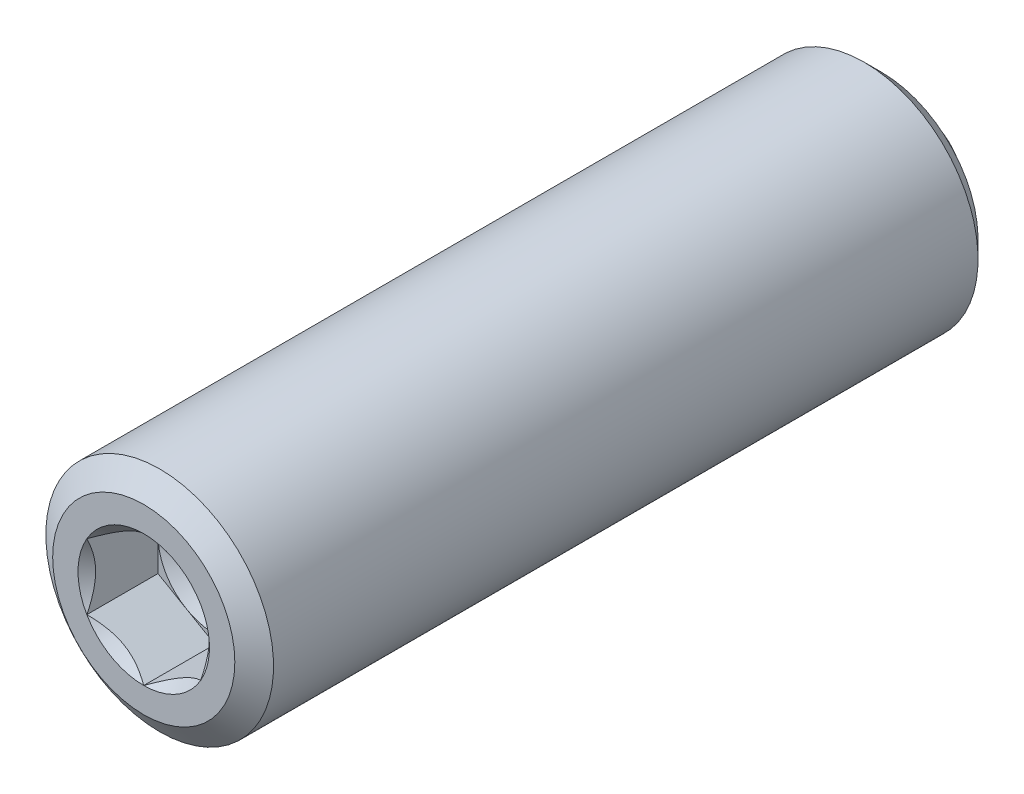
ISO-10303-21;
HEADER;
FILE_DESCRIPTION(('STEP AP214'),'2;1');
FILE_NAME('part.step','',(''),(''),'','','');
FILE_SCHEMA(('AUTOMOTIVE_DESIGN { 1 0 10303 214 1 1 1 1 }'));
ENDSEC;
DATA;
#1=APPLICATION_CONTEXT('core data for automotive mechanical design processes');
#2=APPLICATION_PROTOCOL_DEFINITION('international standard','automotive_design',2000,#1);
#3=PRODUCT_CONTEXT('',#1,'mechanical');
#4=PRODUCT('Part','Part','',(#3));
#5=PRODUCT_RELATED_PRODUCT_CATEGORY('part','',(#4));
#6=PRODUCT_DEFINITION_FORMATION('','',#4);
#7=PRODUCT_DEFINITION_CONTEXT('part definition',#1,'design');
#8=PRODUCT_DEFINITION('design','',#6,#7);
#9=PRODUCT_DEFINITION_SHAPE('','',#8);
#10=(LENGTH_UNIT() NAMED_UNIT(*) SI_UNIT(.MILLI.,.METRE.));
#11=(NAMED_UNIT(*) PLANE_ANGLE_UNIT() SI_UNIT($,.RADIAN.));
#12=(NAMED_UNIT(*) SI_UNIT($,.STERADIAN.) SOLID_ANGLE_UNIT());
#13=UNCERTAINTY_MEASURE_WITH_UNIT(LENGTH_MEASURE(1.E-05),#10,'distance_accuracy_value','');
#14=(GEOMETRIC_REPRESENTATION_CONTEXT(3) GLOBAL_UNCERTAINTY_ASSIGNED_CONTEXT((#13)) GLOBAL_UNIT_ASSIGNED_CONTEXT((#10,
#11,#12)) REPRESENTATION_CONTEXT('',''));
#15=CARTESIAN_POINT('',(0.,0.,0.));
#16=DIRECTION('',(0.,0.,1.));
#17=DIRECTION('',(1.,0.,0.));
#18=AXIS2_PLACEMENT_3D('',#15,#16,#17);
#19=CARTESIAN_POINT('',(0.,0.,-10.4));
#20=DIRECTION('',(0.,0.,-1.));
#21=DIRECTION('',(0.,1.,0.));
#22=AXIS2_PLACEMENT_3D('',#19,#20,#21);
#23=SPHERICAL_SURFACE('',#22,2.);
#24=CARTESIAN_POINT('',(0.,0.,-12.4));
#25=VERTEX_POINT('',#24);
#26=VERTEX_LOOP('',#25);
#27=FACE_BOUND('',#26,.T.);
#28=ADVANCED_FACE('F42',(#27),#23,.T.);
#29=CLOSED_SHELL('',(#28));
#30=MANIFOLD_SOLID_BREP('B2',#29);
#31=CARTESIAN_POINT('',(1.5,0.866025403784456,6.525));
#32=DIRECTION('',(0.,0.,-1.));
#33=DIRECTION('',(-1.,0.,0.));
#34=AXIS2_PLACEMENT_3D('',#31,#32,#33);
#35=PLANE('',#34);
#36=DIRECTION('',(0.,-1.,0.));
#37=VECTOR('',#36,1.);
#38=CARTESIAN_POINT('',(-1.5,0.866025403784456,6.525));
#39=LINE('',#38,#37);
#40=CARTESIAN_POINT('',(-1.5,0.866025403784456,6.525));
#41=VERTEX_POINT('',#40);
#42=CARTESIAN_POINT('',(-1.5,0.,6.525));
#43=VERTEX_POINT('',#42);
#44=EDGE_CURVE('E173',#41,#43,#39,.T.);
#45=ORIENTED_EDGE('',*,*,#44,.T.);
#46=CARTESIAN_POINT('',(0.,0.,6.525));
#47=DIRECTION('',(0.,0.,1.));
#48=DIRECTION('',(1.,0.,0.));
#49=AXIS2_PLACEMENT_3D('',#46,#47,#48);
#50=CIRCLE('',#49,1.5);
#51=CARTESIAN_POINT('',(-0.75,1.29903810567668,6.525));
#52=VERTEX_POINT('',#51);
#53=EDGE_CURVE('E70',#52,#43,#50,.T.);
#54=ORIENTED_EDGE('',*,*,#53,.F.);
#55=DIRECTION('',(-0.866025403784439,-0.5,0.));
#56=VECTOR('',#55,1.);
#57=CARTESIAN_POINT('',(0.,1.73205080756889,6.525));
#58=LINE('',#57,#56);
#59=EDGE_CURVE('E162',#52,#41,#58,.T.);
#60=ORIENTED_EDGE('',*,*,#59,.T.);
#61=EDGE_LOOP('',(#45,#54,#60));
#62=FACE_BOUND('',#61,.T.);
#63=ADVANCED_FACE('F55',(#62),#35,.F.);
#64=CARTESIAN_POINT('',(0.,1.73205080756889,6.525));
#65=VERTEX_POINT('',#64);
#66=EDGE_CURVE('E149',#65,#52,#58,.T.);
#67=ORIENTED_EDGE('',*,*,#66,.T.);
#68=CARTESIAN_POINT('',(0.75,1.29903810567668,6.525));
#69=VERTEX_POINT('',#68);
#70=EDGE_CURVE('E135',#69,#52,#50,.T.);
#71=ORIENTED_EDGE('',*,*,#70,.F.);
#72=DIRECTION('',(-0.866025403784439,0.5,0.));
#73=VECTOR('',#72,1.);
#74=CARTESIAN_POINT('',(1.5,0.866025403784455,6.525));
#75=LINE('',#74,#73);
#76=EDGE_CURVE('E146',#69,#65,#75,.T.);
#77=ORIENTED_EDGE('',*,*,#76,.T.);
#78=EDGE_LOOP('',(#67,#71,#77));
#79=FACE_BOUND('',#78,.T.);
#80=ADVANCED_FACE('F145',(#79),#35,.F.);
#81=CARTESIAN_POINT('',(1.5,0.866025403784455,6.525));
#82=VERTEX_POINT('',#81);
#83=EDGE_CURVE('E153',#82,#69,#75,.T.);
#84=ORIENTED_EDGE('',*,*,#83,.T.);
#85=CARTESIAN_POINT('',(1.5,0.,6.525));
#86=VERTEX_POINT('',#85);
#87=EDGE_CURVE('E133',#86,#69,#50,.T.);
#88=ORIENTED_EDGE('',*,*,#87,.F.);
#89=DIRECTION('',(0.,1.,0.));
#90=VECTOR('',#89,1.);
#91=CARTESIAN_POINT('',(1.5,-0.866025403784423,6.525));
#92=LINE('',#91,#90);
#93=EDGE_CURVE('E160',#86,#82,#92,.T.);
#94=ORIENTED_EDGE('',*,*,#93,.T.);
#95=EDGE_LOOP('',(#84,#88,#94));
#96=FACE_BOUND('',#95,.T.);
#97=ADVANCED_FACE('F159',(#96),#35,.F.);
#98=CARTESIAN_POINT('',(1.5,-0.866025403784423,6.525));
#99=VERTEX_POINT('',#98);
#100=EDGE_CURVE('E184',#99,#86,#92,.T.);
#101=ORIENTED_EDGE('',*,*,#100,.T.);
#102=CARTESIAN_POINT('',(0.75,-1.29903810567664,6.525));
#103=VERTEX_POINT('',#102);
#104=EDGE_CURVE('E137',#103,#86,#50,.T.);
#105=ORIENTED_EDGE('',*,*,#104,.F.);
#106=DIRECTION('',(0.866025403784439,0.5,0.));
#107=VECTOR('',#106,1.);
#108=CARTESIAN_POINT('',(0.,-1.73205080756886,6.525));
#109=LINE('',#108,#107);
#110=EDGE_CURVE('E180',#103,#99,#109,.T.);
#111=ORIENTED_EDGE('',*,*,#110,.T.);
#112=EDGE_LOOP('',(#101,#105,#111));
#113=FACE_BOUND('',#112,.T.);
#114=ADVANCED_FACE('F287',(#113),#35,.F.);
#115=CARTESIAN_POINT('',(0.,-1.73205080756886,6.525));
#116=VERTEX_POINT('',#115);
#117=EDGE_CURVE('E181',#116,#103,#109,.T.);
#118=ORIENTED_EDGE('',*,*,#117,.T.);
#119=CARTESIAN_POINT('',(-0.750000000000001,-1.29903810567664,6.525));
#120=VERTEX_POINT('',#119);
#121=EDGE_CURVE('E298',#120,#103,#50,.T.);
#122=ORIENTED_EDGE('',*,*,#121,.F.);
#123=DIRECTION('',(0.866025403784438,-0.5,0.));
#124=VECTOR('',#123,1.);
#125=CARTESIAN_POINT('',(-1.5,-0.866025403784422,6.525));
#126=LINE('',#125,#124);
#127=EDGE_CURVE('E176',#120,#116,#126,.T.);
#128=ORIENTED_EDGE('',*,*,#127,.T.);
#129=EDGE_LOOP('',(#118,#122,#128));
#130=FACE_BOUND('',#129,.T.);
#131=ADVANCED_FACE('F283',(#130),#35,.F.);
#132=CARTESIAN_POINT('',(0.,0.,-10.4));
#133=DIRECTION('',(0.,0.,-1.));
#134=DIRECTION('',(0.,-1.,0.));
#135=AXIS2_PLACEMENT_3D('',#132,#133,#134);
#136=SPHERICAL_SURFACE('',#135,2.05);
#137=CARTESIAN_POINT('',(0.,0.,-11.04));
#138=DIRECTION('',(0.,0.,-1.));
#139=DIRECTION('',(0.,1.,0.));
#140=AXIS2_PLACEMENT_3D('',#137,#138,#139);
#141=CIRCLE('',#140,1.94753690594042);
#142=CARTESIAN_POINT('',(0.,1.94753690594042,-11.04));
#143=VERTEX_POINT('',#142);
#144=EDGE_CURVE('E59',#143,#143,#141,.T.);
#145=ORIENTED_EDGE('',*,*,#144,.T.);
#146=EDGE_LOOP('',(#145));
#147=FACE_BOUND('',#146,.T.);
#148=ADVANCED_FACE('F57',(#147),#136,.F.);
#149=CARTESIAN_POINT('',(0.,2.54222570361947,-11.04));
#150=DIRECTION('',(0.,0.,-1.));
#151=DIRECTION('',(0.,1.,0.));
#152=AXIS2_PLACEMENT_3D('',#149,#150,#151);
#153=PLANE('',#152);
#154=CARTESIAN_POINT('',(0.,0.,-11.04));
#155=DIRECTION('',(0.,0.,-1.));
#156=DIRECTION('',(0.,1.,0.));
#157=AXIS2_PLACEMENT_3D('',#154,#155,#156);
#158=CIRCLE('',#157,2.54222570361947);
#159=CARTESIAN_POINT('',(0.,2.54222570361947,-11.04));
#160=VERTEX_POINT('',#159);
#161=EDGE_CURVE('E210',#160,#160,#158,.T.);
#162=ORIENTED_EDGE('',*,*,#161,.T.);
#163=EDGE_LOOP('',(#162));
#164=FACE_BOUND('',#163,.T.);
#165=ORIENTED_EDGE('',*,*,#144,.F.);
#166=EDGE_LOOP('',(#165));
#167=FACE_BOUND('',#166,.T.);
#168=ADVANCED_FACE('F293',(#164,#167),#153,.T.);
#169=CARTESIAN_POINT('',(0.,0.,-11.04));
#170=DIRECTION('',(0.,0.,1.));
#171=DIRECTION('',(0.,-1.,0.));
#172=AXIS2_PLACEMENT_3D('',#169,#170,#171);
#173=CONICAL_SURFACE('',#172,2.54222570361947,0.785398163397454);
#174=CARTESIAN_POINT('',(0.,0.,-10.5822257036195));
#175=DIRECTION('',(0.,0.,-1.));
#176=DIRECTION('',(0.,1.,0.));
#177=AXIS2_PLACEMENT_3D('',#174,#175,#176);
#178=CIRCLE('',#177,3.);
#179=CARTESIAN_POINT('',(0.,3.,-10.5822257036195));
#180=VERTEX_POINT('',#179);
#181=EDGE_CURVE('E207',#180,#180,#178,.T.);
#182=ORIENTED_EDGE('',*,*,#181,.T.);
#183=EDGE_LOOP('',(#182));
#184=FACE_BOUND('',#183,.T.);
#185=ORIENTED_EDGE('',*,*,#161,.F.);
#186=EDGE_LOOP('',(#185));
#187=FACE_BOUND('',#186,.T.);
#188=ADVANCED_FACE('F367',(#184,#187),#173,.T.);
#189=CARTESIAN_POINT('',(0.,0.,-12.4));
#190=DIRECTION('',(0.,0.,-1.));
#191=DIRECTION('',(0.,1.,0.));
#192=AXIS2_PLACEMENT_3D('',#189,#190,#191);
#193=CYLINDRICAL_SURFACE('',#192,3.);
#194=CARTESIAN_POINT('',(0.,0.,7.97987547707417));
#195=DIRECTION('',(0.,0.,-1.));
#196=DIRECTION('',(0.,1.,0.));
#197=AXIS2_PLACEMENT_3D('',#194,#195,#196);
#198=CIRCLE('',#197,3.);
#199=CARTESIAN_POINT('',(0.,3.,7.97987547707417));
#200=VERTEX_POINT('',#199);
#201=EDGE_CURVE('E204',#200,#200,#198,.T.);
#202=ORIENTED_EDGE('',*,*,#201,.T.);
#203=EDGE_LOOP('',(#202));
#204=FACE_BOUND('',#203,.T.);
#205=ORIENTED_EDGE('',*,*,#181,.F.);
#206=EDGE_LOOP('',(#205));
#207=FACE_BOUND('',#206,.T.);
#208=ADVANCED_FACE('F360',(#204,#207),#193,.T.);
#209=CARTESIAN_POINT('',(0.,0.,7.97987547707417));
#210=DIRECTION('',(0.,0.,-1.));
#211=DIRECTION('',(0.,1.,0.));
#212=AXIS2_PLACEMENT_3D('',#209,#210,#211);
#213=CONICAL_SURFACE('',#212,3.,0.959931088596882);
#214=CARTESIAN_POINT('',(0.,0.,8.4));
#215=DIRECTION('',(0.,0.,-1.));
#216=DIRECTION('',(0.,1.,0.));
#217=AXIS2_PLACEMENT_3D('',#214,#215,#216);
#218=CIRCLE('',#217,2.4);
#219=CARTESIAN_POINT('',(0.,2.4,8.4));
#220=VERTEX_POINT('',#219);
#221=EDGE_CURVE('E189',#220,#220,#218,.T.);
#222=ORIENTED_EDGE('',*,*,#221,.T.);
#223=EDGE_LOOP('',(#222));
#224=FACE_BOUND('',#223,.T.);
#225=ORIENTED_EDGE('',*,*,#201,.F.);
#226=EDGE_LOOP('',(#225));
#227=FACE_BOUND('',#226,.T.);
#228=ADVANCED_FACE('F355',(#224,#227),#213,.T.);
#229=CARTESIAN_POINT('',(0.,0.,8.4));
#230=DIRECTION('',(0.,0.,1.));
#231=DIRECTION('',(0.,-1.,0.));
#232=AXIS2_PLACEMENT_3D('',#229,#230,#231);
#233=PLANE('',#232);
#234=CARTESIAN_POINT('',(0.,0.,8.4));
#235=DIRECTION('',(0.,0.,1.));
#236=DIRECTION('',(1.,0.,0.));
#237=AXIS2_PLACEMENT_3D('',#234,#235,#236);
#238=CIRCLE('',#237,1.73205080756889);
#239=CARTESIAN_POINT('',(0.,-1.73205080756889,8.4));
#240=VERTEX_POINT('',#239);
#241=CARTESIAN_POINT('',(1.50000000000004,-0.866025403784403,8.4));
#242=VERTEX_POINT('',#241);
#243=EDGE_CURVE('E314',#240,#242,#238,.T.);
#244=ORIENTED_EDGE('',*,*,#243,.F.);
#245=CARTESIAN_POINT('',(-1.5,-0.866025403784422,8.4));
#246=VERTEX_POINT('',#245);
#247=EDGE_CURVE('E315',#246,#240,#238,.T.);
#248=ORIENTED_EDGE('',*,*,#247,.F.);
#249=CARTESIAN_POINT('',(-1.50000000000001,0.86602540378445,8.4));
#250=VERTEX_POINT('',#249);
#251=EDGE_CURVE('E313',#250,#246,#238,.T.);
#252=ORIENTED_EDGE('',*,*,#251,.F.);
#253=CARTESIAN_POINT('',(0.,1.73205080756889,8.4));
#254=VERTEX_POINT('',#253);
#255=EDGE_CURVE('E308',#254,#250,#238,.T.);
#256=ORIENTED_EDGE('',*,*,#255,.F.);
#257=CARTESIAN_POINT('',(1.5,0.866025403784466,8.4));
#258=VERTEX_POINT('',#257);
#259=EDGE_CURVE('E307',#258,#254,#238,.T.);
#260=ORIENTED_EDGE('',*,*,#259,.F.);
#261=EDGE_CURVE('E77',#242,#258,#238,.T.);
#262=ORIENTED_EDGE('',*,*,#261,.F.);
#263=EDGE_LOOP('',(#244,#248,#252,#256,#260,#262));
#264=FACE_BOUND('',#263,.T.);
#265=ORIENTED_EDGE('',*,*,#221,.F.);
#266=EDGE_LOOP('',(#265));
#267=FACE_BOUND('',#266,.T.);
#268=ADVANCED_FACE('F327',(#264,#267),#233,.T.);
#269=CARTESIAN_POINT('',(0.,0.,8.4));
#270=DIRECTION('',(0.,0.,1.));
#271=DIRECTION('',(1.,0.,0.));
#272=AXIS2_PLACEMENT_3D('',#269,#270,#271);
#273=CONICAL_SURFACE('',#272,1.73205080756889,0.78539816339745);
#274=ORIENTED_EDGE('',*,*,#255,.T.);
#275=CARTESIAN_POINT('',(0.000199999999999968,1.73216627762273,8.40011548160007));
#276=CARTESIAN_POINT('',(-0.0513677907370761,1.70239359975917,8.37036547606733));
#277=CARTESIAN_POINT('',(-0.103797917665202,1.67212305186357,8.34236248391031));
#278=CARTESIAN_POINT('',(-0.210709034055599,1.61039789003621,8.29108923044014));
#279=CARTESIAN_POINT('',(-0.265200195814664,1.57893740312616,8.26784750504437));
#280=CARTESIAN_POINT('',(-0.375079081357252,1.51549879897989,8.22803372899222));
#281=CARTESIAN_POINT('',(-0.430438809095204,1.48353684526812,8.2113615856709));
#282=CARTESIAN_POINT('',(-0.542377257477155,1.41890915196213,8.1856744568181));
#283=CARTESIAN_POINT('',(-0.598952556553014,1.3862453878112,8.17664029047886));
#284=CARTESIAN_POINT('',(-0.696455389516447,1.32995210095301,8.16848908122685));
#285=CARTESIAN_POINT('',(-0.737256908280473,1.30639533311125,8.16728225298921));
#286=CARTESIAN_POINT('',(-0.818787969615865,1.25932335290195,8.16931405716226));
#287=CARTESIAN_POINT('',(-0.859517494314637,1.23580815085315,8.17255367074831));
#288=CARTESIAN_POINT('',(-0.940584402163424,1.18900414978428,8.18329198598196));
#289=CARTESIAN_POINT('',(-0.980921384598297,1.16571558211721,8.19079465301873));
#290=CARTESIAN_POINT('',(-1.06091833691404,1.11952932016336,8.20965161192829));
#291=CARTESIAN_POINT('',(-1.10057800851622,1.09663179808787,8.22100755701858));
#292=CARTESIAN_POINT('',(-1.20216313477449,1.037981598097,8.25472164759267));
#293=CARTESIAN_POINT('',(-1.2634585537097,1.00259267147467,8.27962184909336));
#294=CARTESIAN_POINT('',(-1.35358562846332,0.950557780604389,8.32165665327157));
#295=CARTESIAN_POINT('',(-1.38328513990772,0.933410759677162,8.33642515355909));
#296=CARTESIAN_POINT('',(-1.44213790138375,0.899432101996423,8.36731056594016));
#297=CARTESIAN_POINT('',(-1.47129140422064,0.882600319285726,8.38342683412171));
#298=CARTESIAN_POINT('',(-1.5002,0.865909933730618,8.40011548160007));
#299=B_SPLINE_CURVE_WITH_KNOTS('',3,(#275,#276,#277,#278,#279,#280,#281,#282,#283,#284,#285,
#286,#287,#288,#289,#290,#291,#292,#293,#294,#295,#296,#297,#298),.UNSPECIFIED.,.F.,.F.,(4,2,2,
2,2,2,2,2,2,2,2,4),(0.,0.199829143693307,0.400822987382392,0.598623720538186,0.795926240188896,
0.937113067959889,1.07833105577194,1.21968061668223,1.36109089931056,1.58570969637566,
1.69770705470964,1.80965120737194),.UNSPECIFIED.);
#300=EDGE_CURVE('E40',#254,#250,#299,.T.);
#301=ORIENTED_EDGE('',*,*,#300,.F.);
#302=EDGE_LOOP('',(#274,#301));
#303=FACE_BOUND('',#302,.T.);
#304=ADVANCED_FACE('F226',(#303),#273,.F.);
#305=ORIENTED_EDGE('',*,*,#251,.T.);
#306=CARTESIAN_POINT('',(-1.5,-1.7272081296969,8.95557851627076));
#307=CARTESIAN_POINT('',(-1.5,-1.68515175699266,8.9238299078574));
#308=CARTESIAN_POINT('',(-1.5,-1.64286104748672,8.89239259380735));
#309=CARTESIAN_POINT('',(-1.5,-1.5577158103594,8.83026908755638));
#310=CARTESIAN_POINT('',(-1.5,-1.51486114386666,8.79958308589218));
#311=CARTESIAN_POINT('',(-1.5,-1.38468134151269,8.70840719242713));
#312=CARTESIAN_POINT('',(-1.5,-1.29637976071652,8.64928834342675));
#313=CARTESIAN_POINT('',(-1.5,-1.11121478730466,8.53323099631648));
#314=CARTESIAN_POINT('',(-1.5,-1.01415038238166,8.47660955873299));
#315=CARTESIAN_POINT('',(-1.5,-0.815173408897593,8.37303688126563));
#316=CARTESIAN_POINT('',(-1.5,-0.713278669253274,8.32605304154165));
#317=CARTESIAN_POINT('',(-1.5,-0.560333774943103,8.26857266843081));
#318=CARTESIAN_POINT('',(-1.5,-0.511547982948033,8.25207538775723));
#319=CARTESIAN_POINT('',(-1.5,-0.412798620136858,8.22299751292699));
#320=CARTESIAN_POINT('',(-1.5,-0.362834968437555,8.210417188594));
#321=CARTESIAN_POINT('',(-1.5,-0.262863235444974,8.19003619414675));
#322=CARTESIAN_POINT('',(-1.5,-0.212872113808015,8.18215363274596));
#323=CARTESIAN_POINT('',(-1.5,-0.112355243569539,8.17132206396899));
#324=CARTESIAN_POINT('',(-1.5,-0.0618295883726218,8.16837220852434));
#325=CARTESIAN_POINT('',(-1.5,0.0374291733323895,8.16762485772483));
#326=CARTESIAN_POINT('',(-1.5,0.0861609672003042,8.16964473355806));
#327=CARTESIAN_POINT('',(-1.5,0.183206937768831,8.17832255289674));
#328=CARTESIAN_POINT('',(-1.5,0.231521073438273,8.18498094696844));
#329=CARTESIAN_POINT('',(-1.5,0.32819985342544,8.20268524412255));
#330=CARTESIAN_POINT('',(-1.5,0.376550616310332,8.21380581125702));
#331=CARTESIAN_POINT('',(-1.5,0.472195697125602,8.2398434140487));
#332=CARTESIAN_POINT('',(-1.5,0.519490103092743,8.25476013204092));
#333=CARTESIAN_POINT('',(-1.5,0.668391282696627,8.30733522359606));
#334=CARTESIAN_POINT('',(-1.5,0.767878709508555,8.35098128747196));
#335=CARTESIAN_POINT('',(-1.5,0.962179866690727,8.44802299459308));
#336=CARTESIAN_POINT('',(-1.5,1.05697519961444,8.50145366508952));
#337=CARTESIAN_POINT('',(-1.5,1.23814273533383,8.61168585200454));
#338=CARTESIAN_POINT('',(-1.5,1.3246994218129,8.66818792069858));
#339=CARTESIAN_POINT('',(-1.5,1.45222331290674,8.75553430157865));
#340=CARTESIAN_POINT('',(-1.5,1.49418091978756,8.78495775868003));
#341=CARTESIAN_POINT('',(-1.5,1.57752272931477,8.84458282183045));
#342=CARTESIAN_POINT('',(-1.5,1.61890708647355,8.87478421166442));
#343=CARTESIAN_POINT('',(-1.5,1.66005278019494,8.90530817860944));
#344=B_SPLINE_CURVE_WITH_KNOTS('',3,(#306,#307,#308,#309,#310,#311,#312,#313,#314,#315,#316,
#317,#318,#319,#320,#321,#322,#323,#324,#325,#326,#327,#328,#329,#330,#331,#332,#333,#334,#335,
#336,#337,#338,#339,#340,#341,#342,#343),.UNSPECIFIED.,.F.,.F.,(4,2,2,2,2,2,2,2,2,2,2,2,2,2,2,2,
2,2,4),(0.,0.158079548982665,0.316198780993938,0.634850417346953,0.9716903113615,
1.30737131660665,1.46173961127087,1.61611853740676,1.76772101421408,1.91929742368536,
2.06538741209598,2.21149159305542,2.3601498463387,2.50879566386707,2.83376031422671,
3.1599118698565,3.46985601802196,3.62358896039972,3.77727962642069),.UNSPECIFIED.);
#345=EDGE_CURVE('E233',#250,#246,#344,.F.);
#346=ORIENTED_EDGE('',*,*,#345,.F.);
#347=EDGE_LOOP('',(#305,#346));
#348=FACE_BOUND('',#347,.T.);
#349=ADVANCED_FACE('F324',(#348),#273,.F.);
#350=ORIENTED_EDGE('',*,*,#247,.T.);
#351=CARTESIAN_POINT('',(-1.5002,-0.865909933730585,8.40011548160005));
#352=CARTESIAN_POINT('',(-1.44863220926292,-0.89568261159415,8.3703654760673));
#353=CARTESIAN_POINT('',(-1.3962020823348,-0.925953159489749,8.34236248391029));
#354=CARTESIAN_POINT('',(-1.2892909659444,-0.987678321317108,8.29108923044012));
#355=CARTESIAN_POINT('',(-1.23479980418534,-1.01913880822716,8.26784750504435));
#356=CARTESIAN_POINT('',(-1.12492091864275,-1.08257741237343,8.22803372899219));
#357=CARTESIAN_POINT('',(-1.0695611909048,-1.1145393660852,8.21136158567087));
#358=CARTESIAN_POINT('',(-0.957622742522845,-1.17916705939119,8.18567445681808));
#359=CARTESIAN_POINT('',(-0.901047443446987,-1.21183082354212,8.17664029047884));
#360=CARTESIAN_POINT('',(-0.803544610483554,-1.26812411040031,8.16848908122682));
#361=CARTESIAN_POINT('',(-0.762743091719529,-1.29168087824206,8.16728225298919));
#362=CARTESIAN_POINT('',(-0.681212030384138,-1.33875285845137,8.16931405716224));
#363=CARTESIAN_POINT('',(-0.640482505685367,-1.36226806050017,8.17255367074828));
#364=CARTESIAN_POINT('',(-0.559415597836581,-1.40907206156904,8.18329198598193));
#365=CARTESIAN_POINT('',(-0.519078615401709,-1.43236062923611,8.1907946530187));
#366=CARTESIAN_POINT('',(-0.439081663085967,-1.47854689118995,8.20965161192826));
#367=CARTESIAN_POINT('',(-0.399421991483791,-1.50144441326544,8.22100755701856));
#368=CARTESIAN_POINT('',(-0.297836865225514,-1.56009461325632,8.25472164759264));
#369=CARTESIAN_POINT('',(-0.23654144629031,-1.59548353987865,8.27962184909334));
#370=CARTESIAN_POINT('',(-0.146414371536686,-1.64751843074893,8.32165665327155));
#371=CARTESIAN_POINT('',(-0.116714860092282,-1.66466545167615,8.33642515355907));
#372=CARTESIAN_POINT('',(-0.0578620986162489,-1.69864410935689,8.36731056594014));
#373=CARTESIAN_POINT('',(-0.0287085957793631,-1.71547589206759,8.38342683412168));
#374=CARTESIAN_POINT('',(0.000199999999999281,-1.7321662776227,8.40011548160004));
#375=B_SPLINE_CURVE_WITH_KNOTS('',3,(#351,#352,#353,#354,#355,#356,#357,#358,#359,#360,#361,
#362,#363,#364,#365,#366,#367,#368,#369,#370,#371,#372,#373,#374),.UNSPECIFIED.,.F.,.F.,(4,2,2,
2,2,2,2,2,2,2,2,4),(0.,0.199829143693306,0.400822987382392,0.598623720538186,0.795926240188896,
0.937113067959887,1.07833105577193,1.21968061668222,1.36109089931055,1.58570969637566,
1.69770705470964,1.80965120737194),.UNSPECIFIED.);
#376=EDGE_CURVE('E240',#246,#240,#375,.T.);
#377=ORIENTED_EDGE('',*,*,#376,.F.);
#378=EDGE_LOOP('',(#350,#377));
#379=FACE_BOUND('',#378,.T.);
#380=ADVANCED_FACE('F342',(#379),#273,.F.);
#381=ORIENTED_EDGE('',*,*,#243,.T.);
#382=CARTESIAN_POINT('',(-0.000200000000000205,-1.7321662776227,8.40011548160004));
#383=CARTESIAN_POINT('',(0.0513677907370746,-1.70239359975913,8.3703654760673));
#384=CARTESIAN_POINT('',(0.103797917665199,-1.67212305186354,8.34236248391028));
#385=CARTESIAN_POINT('',(0.210709034055594,-1.61039789003618,8.29108923044011));
#386=CARTESIAN_POINT('',(0.265200195814658,-1.57893740312613,8.26784750504435));
#387=CARTESIAN_POINT('',(0.375079081357245,-1.51549879897986,8.22803372899219));
#388=CARTESIAN_POINT('',(0.430438809095196,-1.48353684526809,8.21136158567087));
#389=CARTESIAN_POINT('',(0.542377257477145,-1.4189091519621,8.18567445681808));
#390=CARTESIAN_POINT('',(0.598952556553003,-1.38624538781117,8.17664029047884));
#391=CARTESIAN_POINT('',(0.696455389516435,-1.32995210095298,8.16848908122682));
#392=CARTESIAN_POINT('',(0.73725690828046,-1.30639533311123,8.16728225298919));
#393=CARTESIAN_POINT('',(0.818787969615851,-1.25932335290192,8.16931405716224));
#394=CARTESIAN_POINT('',(0.859517494314622,-1.23580815085312,8.17255367074828));
#395=CARTESIAN_POINT('',(0.940584402163408,-1.18900414978425,8.18329198598193));
#396=CARTESIAN_POINT('',(0.980921384598279,-1.16571558211718,8.1907946530187));
#397=CARTESIAN_POINT('',(1.06091833691402,-1.11952932016334,8.20965161192826));
#398=CARTESIAN_POINT('',(1.1005780085162,-1.09663179808785,8.22100755701856));
#399=CARTESIAN_POINT('',(1.20216313477448,-1.03798159809697,8.25472164759264));
#400=CARTESIAN_POINT('',(1.26345855370968,-1.00259267147464,8.27962184909334));
#401=CARTESIAN_POINT('',(1.35358562846331,-0.950557780604361,8.32165665327155));
#402=CARTESIAN_POINT('',(1.38328513990772,-0.933410759677133,8.33642515355907));
#403=CARTESIAN_POINT('',(1.44213790138375,-0.899432101996392,8.36731056594014));
#404=CARTESIAN_POINT('',(1.47129140422064,-0.882600319285695,8.38342683412169));
#405=CARTESIAN_POINT('',(1.5002,-0.865909933730585,8.40011548160005));
#406=B_SPLINE_CURVE_WITH_KNOTS('',3,(#382,#383,#384,#385,#386,#387,#388,#389,#390,#391,#392,
#393,#394,#395,#396,#397,#398,#399,#400,#401,#402,#403,#404,#405),.UNSPECIFIED.,.F.,.F.,(4,2,2,
2,2,2,2,2,2,2,2,4),(0.,0.199829143693303,0.400822987382385,0.598623720538175,0.795926240188882,
0.937113067959873,1.07833105577192,1.21968061668221,1.36109089931053,1.58570969637565,
1.69770705470963,1.80965120737194),.UNSPECIFIED.);
#407=EDGE_CURVE('E246',#240,#242,#406,.T.);
#408=ORIENTED_EDGE('',*,*,#407,.F.);
#409=EDGE_LOOP('',(#381,#408));
#410=FACE_BOUND('',#409,.T.);
#411=ADVANCED_FACE('F338',(#410),#273,.F.);
#412=ORIENTED_EDGE('',*,*,#261,.T.);
#413=CARTESIAN_POINT('',(1.5,-1.7272081296969,8.95557851627076));
#414=CARTESIAN_POINT('',(1.5,-1.68515175699266,8.9238299078574));
#415=CARTESIAN_POINT('',(1.5,-1.64286104748672,8.89239259380735));
#416=CARTESIAN_POINT('',(1.5,-1.5577158103594,8.83026908755638));
#417=CARTESIAN_POINT('',(1.5,-1.51486114386666,8.79958308589217));
#418=CARTESIAN_POINT('',(1.5,-1.38468134151269,8.70840719242713));
#419=CARTESIAN_POINT('',(1.5,-1.29637976071652,8.64928834342675));
#420=CARTESIAN_POINT('',(1.5,-1.11121478730466,8.53323099631648));
#421=CARTESIAN_POINT('',(1.5,-1.01415038238166,8.47660955873299));
#422=CARTESIAN_POINT('',(1.5,-0.815173408897594,8.37303688126563));
#423=CARTESIAN_POINT('',(1.5,-0.713278669253275,8.32605304154165));
#424=CARTESIAN_POINT('',(1.5,-0.560333774943103,8.26857266843081));
#425=CARTESIAN_POINT('',(1.5,-0.511547982948033,8.25207538775723));
#426=CARTESIAN_POINT('',(1.5,-0.412798620136858,8.22299751292699));
#427=CARTESIAN_POINT('',(1.5,-0.362834968437555,8.210417188594));
#428=CARTESIAN_POINT('',(1.5,-0.262863235444975,8.19003619414675));
#429=CARTESIAN_POINT('',(1.5,-0.212872113808016,8.18215363274596));
#430=CARTESIAN_POINT('',(1.5,-0.112355243569539,8.17132206396899));
#431=CARTESIAN_POINT('',(1.5,-0.0618295883726222,8.16837220852434));
#432=CARTESIAN_POINT('',(1.5,0.0374291733323891,8.16762485772483));
#433=CARTESIAN_POINT('',(1.5,0.0861609672003037,8.16964473355806));
#434=CARTESIAN_POINT('',(1.5,0.183206937768831,8.17832255289674));
#435=CARTESIAN_POINT('',(1.5,0.231521073438273,8.18498094696844));
#436=CARTESIAN_POINT('',(1.5,0.328199853425439,8.20268524412255));
#437=CARTESIAN_POINT('',(1.5,0.376550616310331,8.21380581125702));
#438=CARTESIAN_POINT('',(1.5,0.472195697125601,8.2398434140487));
#439=CARTESIAN_POINT('',(1.5,0.519490103092743,8.25476013204092));
#440=CARTESIAN_POINT('',(1.5,0.668391282696627,8.30733522359606));
#441=CARTESIAN_POINT('',(1.5,0.767878709508555,8.35098128747196));
#442=CARTESIAN_POINT('',(1.5,0.962179866690726,8.44802299459308));
#443=CARTESIAN_POINT('',(1.5,1.05697519961444,8.50145366508952));
#444=CARTESIAN_POINT('',(1.5,1.23814273533383,8.61168585200454));
#445=CARTESIAN_POINT('',(1.5,1.3246994218129,8.66818792069858));
#446=CARTESIAN_POINT('',(1.5,1.45222331290674,8.75553430157865));
#447=CARTESIAN_POINT('',(1.5,1.49418091978756,8.78495775868003));
#448=CARTESIAN_POINT('',(1.5,1.57752272931477,8.84458282183045));
#449=CARTESIAN_POINT('',(1.5,1.61890708647355,8.87478421166443));
#450=CARTESIAN_POINT('',(1.5,1.66005278019494,8.90530817860944));
#451=B_SPLINE_CURVE_WITH_KNOTS('',3,(#413,#414,#415,#416,#417,#418,#419,#420,#421,#422,#423,
#424,#425,#426,#427,#428,#429,#430,#431,#432,#433,#434,#435,#436,#437,#438,#439,#440,#441,#442,
#443,#444,#445,#446,#447,#448,#449,#450),.UNSPECIFIED.,.F.,.F.,(4,2,2,2,2,2,2,2,2,2,2,2,2,2,2,2,
2,2,4),(0.,0.158079548982668,0.31619878099394,0.634850417346953,0.9716903113615,
1.30737131660665,1.46173961127087,1.61611853740676,1.76772101421408,1.91929742368536,
2.06538741209598,2.21149159305542,2.3601498463387,2.50879566386707,2.83376031422671,
3.1599118698565,3.46985601802195,3.62358896039972,3.77727962642069),.UNSPECIFIED.);
#452=EDGE_CURVE('E251',#242,#258,#451,.T.);
#453=ORIENTED_EDGE('',*,*,#452,.F.);
#454=EDGE_LOOP('',(#412,#453));
#455=FACE_BOUND('',#454,.T.);
#456=ADVANCED_FACE('F224',(#455),#273,.F.);
#457=ORIENTED_EDGE('',*,*,#259,.T.);
#458=CARTESIAN_POINT('',(1.5002,0.865909933730618,8.40011548160006));
#459=CARTESIAN_POINT('',(1.44863220926292,0.895682611594182,8.37036547606732));
#460=CARTESIAN_POINT('',(1.3962020823348,0.925953159489782,8.34236248391031));
#461=CARTESIAN_POINT('',(1.2892909659444,0.98767832131714,8.29108923044014));
#462=CARTESIAN_POINT('',(1.23479980418534,1.01913880822719,8.26784750504437));
#463=CARTESIAN_POINT('',(1.12492091864275,1.08257741237346,8.22803372899222));
#464=CARTESIAN_POINT('',(1.0695611909048,1.11453936608523,8.21136158567089));
#465=CARTESIAN_POINT('',(0.957622742522854,1.17916705939122,8.1856744568181));
#466=CARTESIAN_POINT('',(0.901047443446996,1.21183082354215,8.17664029047886));
#467=CARTESIAN_POINT('',(0.803544610483564,1.26812411040034,8.16848908122685));
#468=CARTESIAN_POINT('',(0.762743091719538,1.29168087824209,8.16728225298921));
#469=CARTESIAN_POINT('',(0.681212030384146,1.3387528584514,8.16931405716226));
#470=CARTESIAN_POINT('',(0.640482505685374,1.3622680605002,8.17255367074831));
#471=CARTESIAN_POINT('',(0.559415597836587,1.40907206156907,8.18329198598196));
#472=CARTESIAN_POINT('',(0.519078615401715,1.43236062923614,8.19079465301873));
#473=CARTESIAN_POINT('',(0.439081663085971,1.47854689118998,8.20965161192829));
#474=CARTESIAN_POINT('',(0.399421991483794,1.50144441326547,8.22100755701858));
#475=CARTESIAN_POINT('',(0.297836865225516,1.56009461325635,8.25472164759267));
#476=CARTESIAN_POINT('',(0.236541446290312,1.59548353987868,8.27962184909337));
#477=CARTESIAN_POINT('',(0.146414371536688,1.64751843074896,8.32165665327158));
#478=CARTESIAN_POINT('',(0.116714860092284,1.66466545167618,8.3364251535591));
#479=CARTESIAN_POINT('',(0.0578620986162505,1.69864410935693,8.36731056594017));
#480=CARTESIAN_POINT('',(0.0287085957793638,1.71547589206762,8.38342683412171));
#481=CARTESIAN_POINT('',(-0.000199999999999509,1.73216627762273,8.40011548160007));
#482=B_SPLINE_CURVE_WITH_KNOTS('',3,(#458,#459,#460,#461,#462,#463,#464,#465,#466,#467,#468,
#469,#470,#471,#472,#473,#474,#475,#476,#477,#478,#479,#480,#481),.UNSPECIFIED.,.F.,.F.,(4,2,2,
2,2,2,2,2,2,2,2,4),(0.,0.199829143693303,0.400822987382385,0.598623720538175,0.795926240188881,
0.937113067959874,1.07833105577192,1.21968061668221,1.36109089931054,1.58570969637565,
1.69770705470963,1.80965120737193),.UNSPECIFIED.);
#483=EDGE_CURVE('E157',#258,#254,#482,.T.);
#484=ORIENTED_EDGE('',*,*,#483,.F.);
#485=EDGE_LOOP('',(#457,#484));
#486=FACE_BOUND('',#485,.T.);
#487=ADVANCED_FACE('F219',(#486),#273,.F.);
#488=CARTESIAN_POINT('',(-1.5,-0.866025403784422,6.525));
#489=VERTEX_POINT('',#488);
#490=EDGE_CURVE('E177',#489,#120,#126,.T.);
#491=ORIENTED_EDGE('',*,*,#490,.T.);
#492=EDGE_CURVE('E306',#43,#120,#50,.T.);
#493=ORIENTED_EDGE('',*,*,#492,.F.);
#494=EDGE_CURVE('E172',#43,#489,#39,.T.);
#495=ORIENTED_EDGE('',*,*,#494,.T.);
#496=EDGE_LOOP('',(#491,#493,#495));
#497=FACE_BOUND('',#496,.T.);
#498=ADVANCED_FACE('F223',(#497),#35,.F.);
#499=CARTESIAN_POINT('',(0.,1.73205080756889,6.525));
#500=DIRECTION('',(-0.5,0.866025403784439,0.));
#501=DIRECTION('',(-0.866025403784439,-0.5,0.));
#502=AXIS2_PLACEMENT_3D('',#499,#500,#501);
#503=PLANE('',#502);
#504=DIRECTION('',(0.,0.,1.));
#505=VECTOR('',#504,1.);
#506=CARTESIAN_POINT('',(0.,1.73205080756889,6.525));
#507=LINE('',#506,#505);
#508=EDGE_CURVE('E156',#65,#254,#507,.T.);
#509=ORIENTED_EDGE('',*,*,#508,.T.);
#510=ORIENTED_EDGE('',*,*,#300,.T.);
#511=DIRECTION('',(0.,0.,1.));
#512=VECTOR('',#511,1.);
#513=CARTESIAN_POINT('',(-1.5,0.866025403784456,6.525));
#514=LINE('',#513,#512);
#515=EDGE_CURVE('E198',#41,#250,#514,.T.);
#516=ORIENTED_EDGE('',*,*,#515,.F.);
#517=ORIENTED_EDGE('',*,*,#59,.F.);
#518=ORIENTED_EDGE('',*,*,#66,.F.);
#519=EDGE_LOOP('',(#509,#510,#516,#517,#518));
#520=FACE_BOUND('',#519,.T.);
#521=ADVANCED_FACE('F216',(#520),#503,.F.);
#522=CARTESIAN_POINT('',(-1.5,0.866025403784456,6.525));
#523=DIRECTION('',(-1.,0.,0.));
#524=DIRECTION('',(0.,0.,1.));
#525=AXIS2_PLACEMENT_3D('',#522,#523,#524);
#526=PLANE('',#525);
#527=ORIENTED_EDGE('',*,*,#515,.T.);
#528=ORIENTED_EDGE('',*,*,#345,.T.);
#529=DIRECTION('',(0.,0.,1.));
#530=VECTOR('',#529,1.);
#531=CARTESIAN_POINT('',(-1.5,-0.866025403784422,6.525));
#532=LINE('',#531,#530);
#533=EDGE_CURVE('E196',#489,#246,#532,.T.);
#534=ORIENTED_EDGE('',*,*,#533,.F.);
#535=ORIENTED_EDGE('',*,*,#494,.F.);
#536=ORIENTED_EDGE('',*,*,#44,.F.);
#537=EDGE_LOOP('',(#527,#528,#534,#535,#536));
#538=FACE_BOUND('',#537,.T.);
#539=ADVANCED_FACE('F267',(#538),#526,.F.);
#540=CARTESIAN_POINT('',(-1.5,-0.866025403784422,6.525));
#541=DIRECTION('',(-0.5,-0.866025403784438,0.));
#542=DIRECTION('',(0.866025403784439,-0.5,0.));
#543=AXIS2_PLACEMENT_3D('',#540,#541,#542);
#544=PLANE('',#543);
#545=ORIENTED_EDGE('',*,*,#533,.T.);
#546=ORIENTED_EDGE('',*,*,#376,.T.);
#547=DIRECTION('',(0.,0.,1.));
#548=VECTOR('',#547,1.);
#549=CARTESIAN_POINT('',(0.,-1.73205080756886,6.525));
#550=LINE('',#549,#548);
#551=EDGE_CURVE('E193',#116,#240,#550,.T.);
#552=ORIENTED_EDGE('',*,*,#551,.F.);
#553=ORIENTED_EDGE('',*,*,#127,.F.);
#554=ORIENTED_EDGE('',*,*,#490,.F.);
#555=EDGE_LOOP('',(#545,#546,#552,#553,#554));
#556=FACE_BOUND('',#555,.T.);
#557=ADVANCED_FACE('F263',(#556),#544,.F.);
#558=CARTESIAN_POINT('',(0.,-1.73205080756886,6.525));
#559=DIRECTION('',(0.5,-0.866025403784439,0.));
#560=DIRECTION('',(0.866025403784439,0.5,0.));
#561=AXIS2_PLACEMENT_3D('',#558,#559,#560);
#562=PLANE('',#561);
#563=ORIENTED_EDGE('',*,*,#551,.T.);
#564=ORIENTED_EDGE('',*,*,#407,.T.);
#565=DIRECTION('',(0.,0.,1.));
#566=VECTOR('',#565,1.);
#567=CARTESIAN_POINT('',(1.5,-0.866025403784423,6.525));
#568=LINE('',#567,#566);
#569=EDGE_CURVE('E190',#99,#242,#568,.T.);
#570=ORIENTED_EDGE('',*,*,#569,.F.);
#571=ORIENTED_EDGE('',*,*,#110,.F.);
#572=ORIENTED_EDGE('',*,*,#117,.F.);
#573=EDGE_LOOP('',(#563,#564,#570,#571,#572));
#574=FACE_BOUND('',#573,.T.);
#575=ADVANCED_FACE('F259',(#574),#562,.F.);
#576=CARTESIAN_POINT('',(1.5,-0.866025403784423,6.525));
#577=DIRECTION('',(1.,0.,0.));
#578=DIRECTION('',(0.,1.,0.));
#579=AXIS2_PLACEMENT_3D('',#576,#577,#578);
#580=PLANE('',#579);
#581=ORIENTED_EDGE('',*,*,#569,.T.);
#582=ORIENTED_EDGE('',*,*,#452,.T.);
#583=DIRECTION('',(0.,0.,1.));
#584=VECTOR('',#583,1.);
#585=CARTESIAN_POINT('',(1.5,0.866025403784455,6.525));
#586=LINE('',#585,#584);
#587=EDGE_CURVE('E187',#82,#258,#586,.T.);
#588=ORIENTED_EDGE('',*,*,#587,.F.);
#589=ORIENTED_EDGE('',*,*,#93,.F.);
#590=ORIENTED_EDGE('',*,*,#100,.F.);
#591=EDGE_LOOP('',(#581,#582,#588,#589,#590));
#592=FACE_BOUND('',#591,.T.);
#593=ADVANCED_FACE('F256',(#592),#580,.F.);
#594=CARTESIAN_POINT('',(1.5,0.866025403784455,6.525));
#595=DIRECTION('',(0.5,0.866025403784439,0.));
#596=DIRECTION('',(-0.866025403784439,0.5,0.));
#597=AXIS2_PLACEMENT_3D('',#594,#595,#596);
#598=PLANE('',#597);
#599=ORIENTED_EDGE('',*,*,#587,.T.);
#600=ORIENTED_EDGE('',*,*,#483,.T.);
#601=ORIENTED_EDGE('',*,*,#508,.F.);
#602=ORIENTED_EDGE('',*,*,#76,.F.);
#603=ORIENTED_EDGE('',*,*,#83,.F.);
#604=EDGE_LOOP('',(#599,#600,#601,#602,#603));
#605=FACE_BOUND('',#604,.T.);
#606=ADVANCED_FACE('F130',(#605),#598,.F.);
#607=CARTESIAN_POINT('',(0.,0.,6.525));
#608=DIRECTION('',(0.,0.,1.));
#609=DIRECTION('',(1.,0.,0.));
#610=AXIS2_PLACEMENT_3D('',#607,#608,#609);
#611=CONICAL_SURFACE('',#610,1.5,1.0471975511966);
#612=CARTESIAN_POINT('',(0.,0.,5.65897459621556));
#613=VERTEX_POINT('',#612);
#614=VERTEX_LOOP('',#613);
#615=FACE_BOUND('',#614,.T.);
#616=ORIENTED_EDGE('',*,*,#87,.T.);
#617=ORIENTED_EDGE('',*,*,#70,.T.);
#618=ORIENTED_EDGE('',*,*,#53,.T.);
#619=ORIENTED_EDGE('',*,*,#492,.T.);
#620=ORIENTED_EDGE('',*,*,#121,.T.);
#621=ORIENTED_EDGE('',*,*,#104,.T.);
#622=EDGE_LOOP('',(#616,#617,#618,#619,#620,#621));
#623=FACE_BOUND('',#622,.T.);
#624=ADVANCED_FACE('F128',(#615,#623),#611,.F.);
#625=CLOSED_SHELL('',(#63,#80,#97,#114,#131,#148,#168,#188,#208,#228,#268,#304,#349,#380,#411,
#456,#487,#498,#521,#539,#557,#575,#593,#606,#624));
#626=MANIFOLD_SOLID_BREP('B7',#625);
#627=ADVANCED_BREP_SHAPE_REPRESENTATION('',(#18,#30,#626),#14);
#628=SHAPE_DEFINITION_REPRESENTATION(#9,#627);
ENDSEC;
END-ISO-10303-21;
